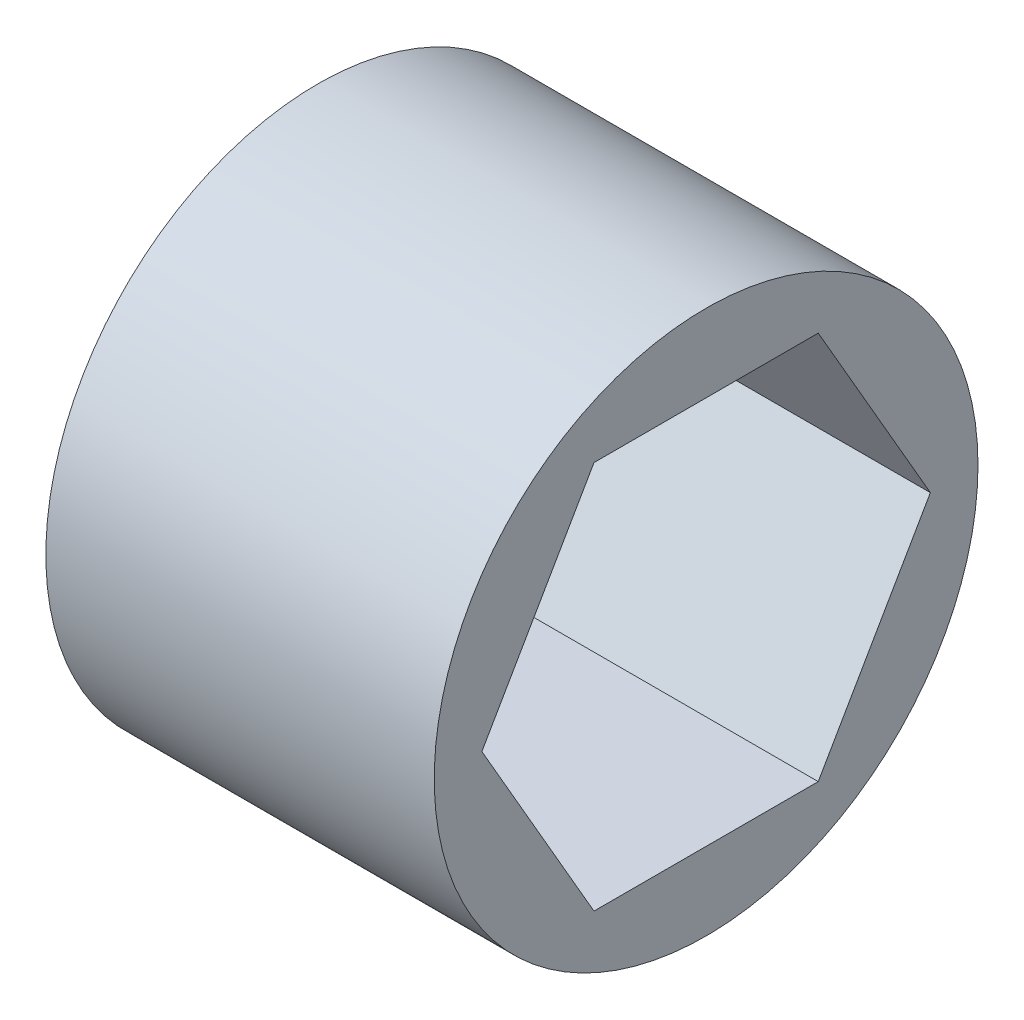
ISO-10303-21;
HEADER;
FILE_DESCRIPTION(('STEP AP214'),'2;1');
FILE_NAME('part.step','',(''),(''),'','','');
FILE_SCHEMA(('AUTOMOTIVE_DESIGN { 1 0 10303 214 1 1 1 1 }'));
ENDSEC;
DATA;
#1=APPLICATION_CONTEXT('core data for automotive mechanical design processes');
#2=APPLICATION_PROTOCOL_DEFINITION('international standard','automotive_design',2000,#1);
#3=PRODUCT_CONTEXT('',#1,'mechanical');
#4=PRODUCT('Part','Part','',(#3));
#5=PRODUCT_RELATED_PRODUCT_CATEGORY('part','',(#4));
#6=PRODUCT_DEFINITION_FORMATION('','',#4);
#7=PRODUCT_DEFINITION_CONTEXT('part definition',#1,'design');
#8=PRODUCT_DEFINITION('design','',#6,#7);
#9=PRODUCT_DEFINITION_SHAPE('','',#8);
#10=(LENGTH_UNIT() NAMED_UNIT(*) SI_UNIT(.MILLI.,.METRE.));
#11=(NAMED_UNIT(*) PLANE_ANGLE_UNIT() SI_UNIT($,.RADIAN.));
#12=(NAMED_UNIT(*) SI_UNIT($,.STERADIAN.) SOLID_ANGLE_UNIT());
#13=UNCERTAINTY_MEASURE_WITH_UNIT(LENGTH_MEASURE(1.E-05),#10,'distance_accuracy_value','');
#14=(GEOMETRIC_REPRESENTATION_CONTEXT(3) GLOBAL_UNCERTAINTY_ASSIGNED_CONTEXT((#13)) GLOBAL_UNIT_ASSIGNED_CONTEXT((#10,
#11,#12)) REPRESENTATION_CONTEXT('',''));
#15=CARTESIAN_POINT('',(0.,0.,0.));
#16=DIRECTION('',(0.,0.,1.));
#17=DIRECTION('',(1.,0.,0.));
#18=AXIS2_PLACEMENT_3D('',#15,#16,#17);
#19=CARTESIAN_POINT('',(12.7,0.,0.));
#20=DIRECTION('',(1.,0.,0.));
#21=DIRECTION('',(0.,0.,-1.));
#22=AXIS2_PLACEMENT_3D('',#19,#20,#21);
#23=PLANE('',#22);
#24=CARTESIAN_POINT('',(12.7,0.,0.));
#25=DIRECTION('',(1.,0.,0.));
#26=DIRECTION('',(0.,0.,-1.));
#27=AXIS2_PLACEMENT_3D('',#24,#25,#26);
#28=CIRCLE('',#27,8.89);
#29=CARTESIAN_POINT('',(12.7,0.,-8.89));
#30=VERTEX_POINT('',#29);
#31=EDGE_CURVE('E11',#30,#30,#28,.T.);
#32=ORIENTED_EDGE('',*,*,#31,.T.);
#33=EDGE_LOOP('',(#32));
#34=FACE_BOUND('',#33,.T.);
#35=DIRECTION('',(0.,0.,1.));
#36=VECTOR('',#35,1.);
#37=CARTESIAN_POINT('',(12.7,6.35,-3.66617420935412));
#38=LINE('',#37,#36);
#39=CARTESIAN_POINT('',(12.7,6.35,-3.66617420935412));
#40=VERTEX_POINT('',#39);
#41=CARTESIAN_POINT('',(12.7,6.35,3.66617420935412));
#42=VERTEX_POINT('',#41);
#43=EDGE_CURVE('E95',#40,#42,#38,.T.);
#44=ORIENTED_EDGE('',*,*,#43,.F.);
#45=DIRECTION('',(0.,0.866025403784438,0.5));
#46=VECTOR('',#45,1.);
#47=CARTESIAN_POINT('',(12.7,0.,-7.33234841870825));
#48=LINE('',#47,#46);
#49=CARTESIAN_POINT('',(12.7,0.,-7.33234841870825));
#50=VERTEX_POINT('',#49);
#51=EDGE_CURVE('E87',#50,#40,#48,.T.);
#52=ORIENTED_EDGE('',*,*,#51,.F.);
#53=DIRECTION('',(0.,0.866025403784439,-0.5));
#54=VECTOR('',#53,1.);
#55=CARTESIAN_POINT('',(12.7,-6.35,-3.66617420935412));
#56=LINE('',#55,#54);
#57=CARTESIAN_POINT('',(12.7,-6.35,-3.66617420935413));
#58=VERTEX_POINT('',#57);
#59=EDGE_CURVE('E115',#58,#50,#56,.T.);
#60=ORIENTED_EDGE('',*,*,#59,.F.);
#61=DIRECTION('',(0.,0.,-1.));
#62=VECTOR('',#61,1.);
#63=CARTESIAN_POINT('',(12.7,-6.35,3.66617420935412));
#64=LINE('',#63,#62);
#65=CARTESIAN_POINT('',(12.7,-6.35,3.66617420935412));
#66=VERTEX_POINT('',#65);
#67=EDGE_CURVE('E113',#66,#58,#64,.T.);
#68=ORIENTED_EDGE('',*,*,#67,.F.);
#69=DIRECTION('',(0.,-0.866025403784438,-0.5));
#70=VECTOR('',#69,1.);
#71=CARTESIAN_POINT('',(12.7,0.,7.33234841870824));
#72=LINE('',#71,#70);
#73=CARTESIAN_POINT('',(12.7,0.,7.33234841870824));
#74=VERTEX_POINT('',#73);
#75=EDGE_CURVE('E109',#74,#66,#72,.T.);
#76=ORIENTED_EDGE('',*,*,#75,.F.);
#77=DIRECTION('',(0.,-0.866025403784439,0.5));
#78=VECTOR('',#77,1.);
#79=CARTESIAN_POINT('',(12.7,6.35,3.66617420935412));
#80=LINE('',#79,#78);
#81=EDGE_CURVE('E107',#42,#74,#80,.T.);
#82=ORIENTED_EDGE('',*,*,#81,.F.);
#83=EDGE_LOOP('',(#44,#52,#60,#68,#76,#82));
#84=FACE_BOUND('',#83,.T.);
#85=ADVANCED_FACE('F34',(#34,#84),#23,.T.);
#86=CARTESIAN_POINT('',(0.,0.,0.));
#87=DIRECTION('',(1.,0.,0.));
#88=DIRECTION('',(0.,0.,-1.));
#89=AXIS2_PLACEMENT_3D('',#86,#87,#88);
#90=PLANE('',#89);
#91=CARTESIAN_POINT('',(0.,0.,0.));
#92=DIRECTION('',(1.,0.,0.));
#93=DIRECTION('',(0.,0.,-1.));
#94=AXIS2_PLACEMENT_3D('',#91,#92,#93);
#95=CIRCLE('',#94,8.89);
#96=CARTESIAN_POINT('',(0.,0.,-8.89));
#97=VERTEX_POINT('',#96);
#98=EDGE_CURVE('E38',#97,#97,#95,.T.);
#99=ORIENTED_EDGE('',*,*,#98,.F.);
#100=EDGE_LOOP('',(#99));
#101=FACE_BOUND('',#100,.T.);
#102=DIRECTION('',(0.,0.866025403784438,0.5));
#103=VECTOR('',#102,1.);
#104=CARTESIAN_POINT('',(0.,0.,-7.33234841870825));
#105=LINE('',#104,#103);
#106=CARTESIAN_POINT('',(0.,0.,-7.33234841870825));
#107=VERTEX_POINT('',#106);
#108=CARTESIAN_POINT('',(0.,6.35,-3.66617420935412));
#109=VERTEX_POINT('',#108);
#110=EDGE_CURVE('E57',#107,#109,#105,.T.);
#111=ORIENTED_EDGE('',*,*,#110,.T.);
#112=DIRECTION('',(0.,0.,1.));
#113=VECTOR('',#112,1.);
#114=CARTESIAN_POINT('',(0.,6.35,-3.66617420935412));
#115=LINE('',#114,#113);
#116=CARTESIAN_POINT('',(0.,6.35,3.66617420935412));
#117=VERTEX_POINT('',#116);
#118=EDGE_CURVE('E102',#109,#117,#115,.T.);
#119=ORIENTED_EDGE('',*,*,#118,.T.);
#120=DIRECTION('',(0.,-0.866025403784439,0.5));
#121=VECTOR('',#120,1.);
#122=CARTESIAN_POINT('',(0.,6.35,3.66617420935412));
#123=LINE('',#122,#121);
#124=CARTESIAN_POINT('',(0.,0.,7.33234841870824));
#125=VERTEX_POINT('',#124);
#126=EDGE_CURVE('E119',#117,#125,#123,.T.);
#127=ORIENTED_EDGE('',*,*,#126,.T.);
#128=DIRECTION('',(0.,-0.866025403784438,-0.5));
#129=VECTOR('',#128,1.);
#130=CARTESIAN_POINT('',(0.,0.,7.33234841870824));
#131=LINE('',#130,#129);
#132=CARTESIAN_POINT('',(0.,-6.35,3.66617420935412));
#133=VERTEX_POINT('',#132);
#134=EDGE_CURVE('E122',#125,#133,#131,.T.);
#135=ORIENTED_EDGE('',*,*,#134,.T.);
#136=DIRECTION('',(0.,0.,-1.));
#137=VECTOR('',#136,1.);
#138=CARTESIAN_POINT('',(0.,-6.35,3.66617420935412));
#139=LINE('',#138,#137);
#140=CARTESIAN_POINT('',(0.,-6.35,-3.66617420935412));
#141=VERTEX_POINT('',#140);
#142=EDGE_CURVE('E125',#133,#141,#139,.T.);
#143=ORIENTED_EDGE('',*,*,#142,.T.);
#144=DIRECTION('',(0.,0.866025403784439,-0.5));
#145=VECTOR('',#144,1.);
#146=CARTESIAN_POINT('',(0.,-6.35,-3.66617420935412));
#147=LINE('',#146,#145);
#148=EDGE_CURVE('E96',#141,#107,#147,.T.);
#149=ORIENTED_EDGE('',*,*,#148,.T.);
#150=EDGE_LOOP('',(#111,#119,#127,#135,#143,#149));
#151=FACE_BOUND('',#150,.T.);
#152=ADVANCED_FACE('F142',(#101,#151),#90,.F.);
#153=CARTESIAN_POINT('',(12.7,0.,0.));
#154=DIRECTION('',(-1.,0.,0.));
#155=DIRECTION('',(0.,0.,1.));
#156=AXIS2_PLACEMENT_3D('',#153,#154,#155);
#157=CYLINDRICAL_SURFACE('',#156,8.89);
#158=ORIENTED_EDGE('',*,*,#31,.F.);
#159=EDGE_LOOP('',(#158));
#160=FACE_BOUND('',#159,.T.);
#161=ORIENTED_EDGE('',*,*,#98,.T.);
#162=EDGE_LOOP('',(#161));
#163=FACE_BOUND('',#162,.T.);
#164=ADVANCED_FACE('F36',(#160,#163),#157,.T.);
#165=CARTESIAN_POINT('',(12.7,0.,-7.33234841870825));
#166=DIRECTION('',(0.,-0.5,0.866025403784438));
#167=DIRECTION('',(0.,-0.866025403784439,-0.5));
#168=AXIS2_PLACEMENT_3D('',#165,#166,#167);
#169=PLANE('',#168);
#170=ORIENTED_EDGE('',*,*,#110,.F.);
#171=DIRECTION('',(-1.,0.,0.));
#172=VECTOR('',#171,1.);
#173=CARTESIAN_POINT('',(12.7,0.,-7.33234841870825));
#174=LINE('',#173,#172);
#175=EDGE_CURVE('E91',#50,#107,#174,.T.);
#176=ORIENTED_EDGE('',*,*,#175,.F.);
#177=ORIENTED_EDGE('',*,*,#51,.T.);
#178=DIRECTION('',(-1.,0.,0.));
#179=VECTOR('',#178,1.);
#180=CARTESIAN_POINT('',(12.7,6.35,-3.66617420935412));
#181=LINE('',#180,#179);
#182=EDGE_CURVE('E90',#40,#109,#181,.T.);
#183=ORIENTED_EDGE('',*,*,#182,.T.);
#184=EDGE_LOOP('',(#170,#176,#177,#183));
#185=FACE_BOUND('',#184,.T.);
#186=ADVANCED_FACE('F89',(#185),#169,.T.);
#187=CARTESIAN_POINT('',(12.7,6.35,-3.66617420935412));
#188=DIRECTION('',(0.,-1.,0.));
#189=DIRECTION('',(0.,0.,-1.));
#190=AXIS2_PLACEMENT_3D('',#187,#188,#189);
#191=PLANE('',#190);
#192=ORIENTED_EDGE('',*,*,#118,.F.);
#193=ORIENTED_EDGE('',*,*,#182,.F.);
#194=ORIENTED_EDGE('',*,*,#43,.T.);
#195=DIRECTION('',(-1.,0.,0.));
#196=VECTOR('',#195,1.);
#197=CARTESIAN_POINT('',(12.7,6.35,3.66617420935412));
#198=LINE('',#197,#196);
#199=EDGE_CURVE('E103',#42,#117,#198,.T.);
#200=ORIENTED_EDGE('',*,*,#199,.T.);
#201=EDGE_LOOP('',(#192,#193,#194,#200));
#202=FACE_BOUND('',#201,.T.);
#203=ADVANCED_FACE('F99',(#202),#191,.T.);
#204=CARTESIAN_POINT('',(12.7,6.35,3.66617420935412));
#205=DIRECTION('',(0.,-0.5,-0.866025403784439));
#206=DIRECTION('',(0.,0.866025403784439,-0.5));
#207=AXIS2_PLACEMENT_3D('',#204,#205,#206);
#208=PLANE('',#207);
#209=ORIENTED_EDGE('',*,*,#126,.F.);
#210=ORIENTED_EDGE('',*,*,#199,.F.);
#211=ORIENTED_EDGE('',*,*,#81,.T.);
#212=DIRECTION('',(-1.,0.,0.));
#213=VECTOR('',#212,1.);
#214=CARTESIAN_POINT('',(12.7,0.,7.33234841870824));
#215=LINE('',#214,#213);
#216=EDGE_CURVE('E134',#74,#125,#215,.T.);
#217=ORIENTED_EDGE('',*,*,#216,.T.);
#218=EDGE_LOOP('',(#209,#210,#211,#217));
#219=FACE_BOUND('',#218,.T.);
#220=ADVANCED_FACE('F138',(#219),#208,.T.);
#221=CARTESIAN_POINT('',(12.7,0.,7.33234841870824));
#222=DIRECTION('',(0.,0.5,-0.866025403784438));
#223=DIRECTION('',(0.,0.866025403784439,0.5));
#224=AXIS2_PLACEMENT_3D('',#221,#222,#223);
#225=PLANE('',#224);
#226=ORIENTED_EDGE('',*,*,#134,.F.);
#227=ORIENTED_EDGE('',*,*,#216,.F.);
#228=ORIENTED_EDGE('',*,*,#75,.T.);
#229=DIRECTION('',(-1.,0.,0.));
#230=VECTOR('',#229,1.);
#231=CARTESIAN_POINT('',(12.7,-6.35,3.66617420935412));
#232=LINE('',#231,#230);
#233=EDGE_CURVE('E132',#66,#133,#232,.T.);
#234=ORIENTED_EDGE('',*,*,#233,.T.);
#235=EDGE_LOOP('',(#226,#227,#228,#234));
#236=FACE_BOUND('',#235,.T.);
#237=ADVANCED_FACE('F150',(#236),#225,.T.);
#238=CARTESIAN_POINT('',(12.7,-6.35,3.66617420935412));
#239=DIRECTION('',(0.,1.,0.));
#240=DIRECTION('',(0.,0.,1.));
#241=AXIS2_PLACEMENT_3D('',#238,#239,#240);
#242=PLANE('',#241);
#243=ORIENTED_EDGE('',*,*,#142,.F.);
#244=ORIENTED_EDGE('',*,*,#233,.F.);
#245=ORIENTED_EDGE('',*,*,#67,.T.);
#246=DIRECTION('',(-1.,0.,0.));
#247=VECTOR('',#246,1.);
#248=CARTESIAN_POINT('',(12.7,-6.35,-3.66617420935412));
#249=LINE('',#248,#247);
#250=EDGE_CURVE('E49',#58,#141,#249,.T.);
#251=ORIENTED_EDGE('',*,*,#250,.T.);
#252=EDGE_LOOP('',(#243,#244,#245,#251));
#253=FACE_BOUND('',#252,.T.);
#254=ADVANCED_FACE('F148',(#253),#242,.T.);
#255=CARTESIAN_POINT('',(12.7,-6.35,-3.66617420935412));
#256=DIRECTION('',(0.,0.5,0.866025403784439));
#257=DIRECTION('',(0.,-0.866025403784439,0.5));
#258=AXIS2_PLACEMENT_3D('',#255,#256,#257);
#259=PLANE('',#258);
#260=ORIENTED_EDGE('',*,*,#148,.F.);
#261=ORIENTED_EDGE('',*,*,#250,.F.);
#262=ORIENTED_EDGE('',*,*,#59,.T.);
#263=ORIENTED_EDGE('',*,*,#175,.T.);
#264=EDGE_LOOP('',(#260,#261,#262,#263));
#265=FACE_BOUND('',#264,.T.);
#266=ADVANCED_FACE('F144',(#265),#259,.T.);
#267=CLOSED_SHELL('',(#85,#152,#164,#186,#203,#220,#237,#254,#266));
#268=MANIFOLD_SOLID_BREP('B2',#267);
#269=ADVANCED_BREP_SHAPE_REPRESENTATION('',(#18,#268),#14);
#270=SHAPE_DEFINITION_REPRESENTATION(#9,#269);
ENDSEC;
END-ISO-10303-21;
